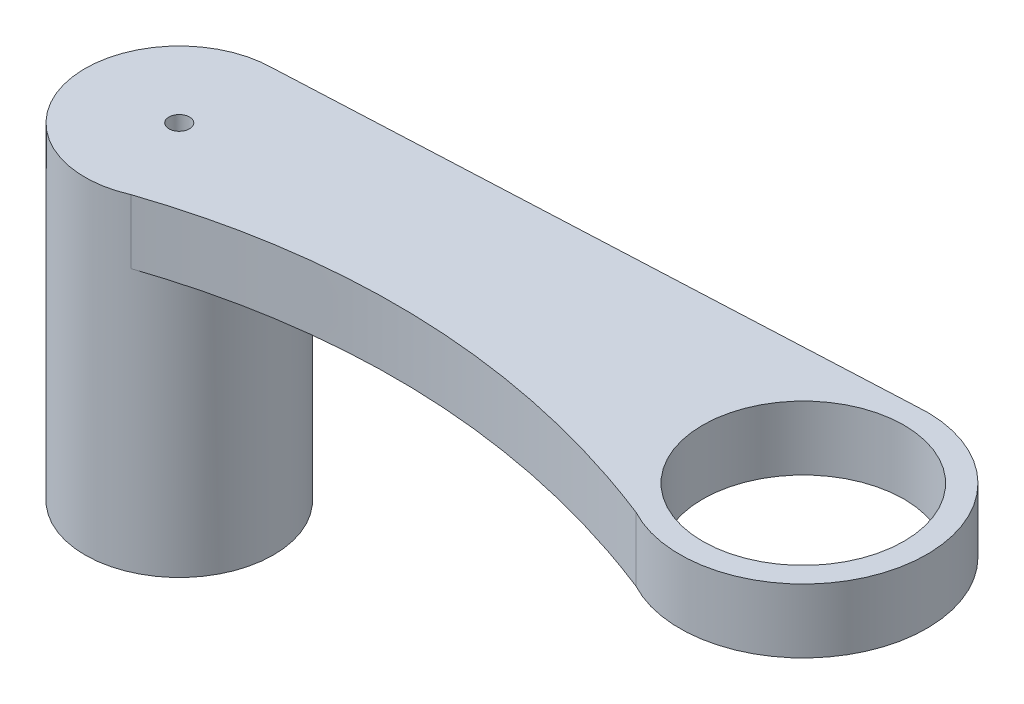
ISO-10303-21;
HEADER;
FILE_DESCRIPTION(('STEP AP214'),'2;1');
FILE_NAME('part.step','',(''),(''),'','','');
FILE_SCHEMA(('AUTOMOTIVE_DESIGN { 1 0 10303 214 1 1 1 1 }'));
ENDSEC;
DATA;
#1=APPLICATION_CONTEXT('core data for automotive mechanical design processes');
#2=APPLICATION_PROTOCOL_DEFINITION('international standard','automotive_design',2000,#1);
#3=PRODUCT_CONTEXT('',#1,'mechanical');
#4=PRODUCT('Part','Part','',(#3));
#5=PRODUCT_RELATED_PRODUCT_CATEGORY('part','',(#4));
#6=PRODUCT_DEFINITION_FORMATION('','',#4);
#7=PRODUCT_DEFINITION_CONTEXT('part definition',#1,'design');
#8=PRODUCT_DEFINITION('design','',#6,#7);
#9=PRODUCT_DEFINITION_SHAPE('','',#8);
#10=(LENGTH_UNIT() NAMED_UNIT(*) SI_UNIT(.MILLI.,.METRE.));
#11=(NAMED_UNIT(*) PLANE_ANGLE_UNIT() SI_UNIT($,.RADIAN.));
#12=(NAMED_UNIT(*) SI_UNIT($,.STERADIAN.) SOLID_ANGLE_UNIT());
#13=UNCERTAINTY_MEASURE_WITH_UNIT(LENGTH_MEASURE(1.E-05),#10,'distance_accuracy_value','');
#14=(GEOMETRIC_REPRESENTATION_CONTEXT(3) GLOBAL_UNCERTAINTY_ASSIGNED_CONTEXT((#13)) GLOBAL_UNIT_ASSIGNED_CONTEXT((#10,
#11,#12)) REPRESENTATION_CONTEXT('',''));
#15=CARTESIAN_POINT('',(0.,0.,0.));
#16=DIRECTION('',(0.,0.,1.));
#17=DIRECTION('',(1.,0.,0.));
#18=AXIS2_PLACEMENT_3D('',#15,#16,#17);
#19=CARTESIAN_POINT('',(0.,35.75,0.));
#20=DIRECTION('',(0.,-1.,0.));
#21=DIRECTION('',(0.,0.,-1.));
#22=AXIS2_PLACEMENT_3D('',#19,#20,#21);
#23=CYLINDRICAL_SURFACE('',#22,10.3);
#24=CARTESIAN_POINT('',(0.,28.75,0.));
#25=DIRECTION('',(0.,-1.,0.));
#26=DIRECTION('',(0.,0.,-1.));
#27=AXIS2_PLACEMENT_3D('',#24,#25,#26);
#28=CIRCLE('',#27,10.3);
#29=CARTESIAN_POINT('',(0.,28.75,-10.3));
#30=VERTEX_POINT('',#29);
#31=CARTESIAN_POINT('',(4.16990453527767,28.75,9.41816840827721));
#32=VERTEX_POINT('',#31);
#33=EDGE_CURVE('E106',#30,#32,#28,.T.);
#34=ORIENTED_EDGE('',*,*,#33,.T.);
#35=DIRECTION('',(0.,1.,0.));
#36=VECTOR('',#35,1.);
#37=CARTESIAN_POINT('',(4.16990453527767,28.75,9.41816840827721));
#38=LINE('',#37,#36);
#39=CARTESIAN_POINT('',(4.16990453527767,35.75,9.41816840827721));
#40=VERTEX_POINT('',#39);
#41=EDGE_CURVE('E69',#32,#40,#38,.T.);
#42=ORIENTED_EDGE('',*,*,#41,.T.);
#43=CARTESIAN_POINT('',(0.,35.75,0.));
#44=DIRECTION('',(0.,1.,0.));
#45=DIRECTION('',(0.,0.,1.));
#46=AXIS2_PLACEMENT_3D('',#43,#44,#45);
#47=CIRCLE('',#46,10.3);
#48=CARTESIAN_POINT('',(0.,35.75,-10.3));
#49=VERTEX_POINT('',#48);
#50=EDGE_CURVE('E11',#49,#40,#47,.T.);
#51=ORIENTED_EDGE('',*,*,#50,.F.);
#52=DIRECTION('',(0.,1.,0.));
#53=VECTOR('',#52,1.);
#54=CARTESIAN_POINT('',(0.,28.75,-10.3));
#55=LINE('',#54,#53);
#56=EDGE_CURVE('E100',#30,#49,#55,.T.);
#57=ORIENTED_EDGE('',*,*,#56,.F.);
#58=EDGE_LOOP('',(#34,#42,#51,#57));
#59=FACE_BOUND('',#58,.T.);
#60=CARTESIAN_POINT('',(0.,0.,0.));
#61=DIRECTION('',(0.,1.,0.));
#62=DIRECTION('',(0.,0.,1.));
#63=AXIS2_PLACEMENT_3D('',#60,#61,#62);
#64=CIRCLE('',#63,10.3);
#65=CARTESIAN_POINT('',(0.,0.,10.3));
#66=VERTEX_POINT('',#65);
#67=EDGE_CURVE('E53',#66,#66,#64,.T.);
#68=ORIENTED_EDGE('',*,*,#67,.T.);
#69=EDGE_LOOP('',(#68));
#70=FACE_BOUND('',#69,.T.);
#71=ADVANCED_FACE('F44',(#59,#70),#23,.T.);
#72=CARTESIAN_POINT('',(0.,35.75,0.));
#73=DIRECTION('',(0.,1.,0.));
#74=DIRECTION('',(0.,0.,1.));
#75=AXIS2_PLACEMENT_3D('',#72,#73,#74);
#76=PLANE('',#75);
#77=CARTESIAN_POINT('',(68.2073015610216,35.75,0.));
#78=DIRECTION('',(0.,1.,0.));
#79=DIRECTION('',(0.,0.,1.));
#80=AXIS2_PLACEMENT_3D('',#77,#78,#79);
#81=CIRCLE('',#80,11.);
#82=CARTESIAN_POINT('',(68.2073015610216,35.75,11.));
#83=VERTEX_POINT('',#82);
#84=EDGE_CURVE('E307',#83,#83,#81,.T.);
#85=ORIENTED_EDGE('',*,*,#84,.F.);
#86=EDGE_LOOP('',(#85));
#87=FACE_BOUND('',#86,.T.);
#88=CARTESIAN_POINT('',(0.,35.75,0.));
#89=DIRECTION('',(0.,-1.,0.));
#90=DIRECTION('',(0.,0.,-1.));
#91=AXIS2_PLACEMENT_3D('',#88,#89,#90);
#92=CIRCLE('',#91,1.12499999999999);
#93=CARTESIAN_POINT('',(0.,35.75,-1.12499999999999));
#94=VERTEX_POINT('',#93);
#95=EDGE_CURVE('E145',#94,#94,#92,.T.);
#96=ORIENTED_EDGE('',*,*,#95,.T.);
#97=EDGE_LOOP('',(#96));
#98=FACE_BOUND('',#97,.T.);
#99=ORIENTED_EDGE('',*,*,#50,.T.);
#100=CARTESIAN_POINT('',(4.16990453527767,35.75,9.41816840827721));
#101=CARTESIAN_POINT('',(22.46177603715,35.75,3.24596138026616));
#102=CARTESIAN_POINT('',(41.93415181531,35.75,4.07724305719363));
#103=CARTESIAN_POINT('',(61.8200064973479,35.75,11.8933789046499));
#104=B_SPLINE_CURVE_WITH_KNOTS('',3,(#100,#101,#102,#103),.UNSPECIFIED.,.F.,.F.,(4,4),(0.,1.),.UNSPECIFIED.);
#105=CARTESIAN_POINT('',(61.8200064973479,35.75,11.8933789046499));
#106=VERTEX_POINT('',#105);
#107=EDGE_CURVE('E84',#40,#106,#104,.T.);
#108=ORIENTED_EDGE('',*,*,#107,.T.);
#109=CARTESIAN_POINT('',(68.2073015610216,35.75,0.));
#110=DIRECTION('',(0.,1.,0.));
#111=DIRECTION('',(0.,0.,1.));
#112=AXIS2_PLACEMENT_3D('',#109,#110,#111);
#113=CIRCLE('',#112,13.5);
#114=CARTESIAN_POINT('',(66.9433570662362,35.75,-13.4407010350689));
#115=VERTEX_POINT('',#114);
#116=EDGE_CURVE('E127',#106,#115,#113,.T.);
#117=ORIENTED_EDGE('',*,*,#116,.T.);
#118=DIRECTION('',(-0.998901267413146,0.,0.0468642503451384));
#119=VECTOR('',#118,1.);
#120=CARTESIAN_POINT('',(66.9433570662362,35.75,-13.4407010350689));
#121=LINE('',#120,#119);
#122=EDGE_CURVE('E60',#115,#49,#121,.T.);
#123=ORIENTED_EDGE('',*,*,#122,.T.);
#124=EDGE_LOOP('',(#99,#108,#117,#123));
#125=FACE_BOUND('',#124,.T.);
#126=ADVANCED_FACE('F156',(#87,#98,#125),#76,.T.);
#127=CARTESIAN_POINT('',(0.,0.,0.));
#128=DIRECTION('',(0.,1.,0.));
#129=DIRECTION('',(0.,0.,1.));
#130=AXIS2_PLACEMENT_3D('',#127,#128,#129);
#131=PLANE('',#130);
#132=CARTESIAN_POINT('',(7.24,0.,0.));
#133=DIRECTION('',(0.,-1.,0.));
#134=DIRECTION('',(0.,0.,-1.));
#135=AXIS2_PLACEMENT_3D('',#132,#133,#134);
#136=CIRCLE('',#135,0.7);
#137=CARTESIAN_POINT('',(7.24,0.,-0.7));
#138=VERTEX_POINT('',#137);
#139=EDGE_CURVE('E308',#138,#138,#136,.T.);
#140=ORIENTED_EDGE('',*,*,#139,.F.);
#141=EDGE_LOOP('',(#140));
#142=FACE_BOUND('',#141,.T.);
#143=CARTESIAN_POINT('',(-7.24,0.,0.));
#144=DIRECTION('',(0.,-1.,0.));
#145=DIRECTION('',(0.,0.,-1.));
#146=AXIS2_PLACEMENT_3D('',#143,#144,#145);
#147=CIRCLE('',#146,0.7);
#148=CARTESIAN_POINT('',(-7.24,0.,-0.7));
#149=VERTEX_POINT('',#148);
#150=EDGE_CURVE('E314',#149,#149,#147,.T.);
#151=ORIENTED_EDGE('',*,*,#150,.F.);
#152=EDGE_LOOP('',(#151));
#153=FACE_BOUND('',#152,.T.);
#154=CARTESIAN_POINT('',(0.,0.,-7.24));
#155=DIRECTION('',(0.,-1.,0.));
#156=DIRECTION('',(0.,0.,-1.));
#157=AXIS2_PLACEMENT_3D('',#154,#155,#156);
#158=CIRCLE('',#157,0.7);
#159=CARTESIAN_POINT('',(0.,0.,-7.94));
#160=VERTEX_POINT('',#159);
#161=EDGE_CURVE('E324',#160,#160,#158,.T.);
#162=ORIENTED_EDGE('',*,*,#161,.F.);
#163=EDGE_LOOP('',(#162));
#164=FACE_BOUND('',#163,.T.);
#165=CARTESIAN_POINT('',(0.,0.,7.24));
#166=DIRECTION('',(0.,-1.,0.));
#167=DIRECTION('',(0.,0.,-1.));
#168=AXIS2_PLACEMENT_3D('',#165,#166,#167);
#169=CIRCLE('',#168,0.7);
#170=CARTESIAN_POINT('',(0.,0.,6.54));
#171=VERTEX_POINT('',#170);
#172=EDGE_CURVE('E332',#171,#171,#169,.T.);
#173=ORIENTED_EDGE('',*,*,#172,.F.);
#174=EDGE_LOOP('',(#173));
#175=FACE_BOUND('',#174,.T.);
#176=CARTESIAN_POINT('',(0.,0.,0.));
#177=DIRECTION('',(0.,-1.,0.));
#178=DIRECTION('',(0.,0.,-1.));
#179=AXIS2_PLACEMENT_3D('',#176,#177,#178);
#180=CIRCLE('',#179,1.125);
#181=CARTESIAN_POINT('',(0.,0.,-1.125));
#182=VERTEX_POINT('',#181);
#183=EDGE_CURVE('E137',#182,#182,#180,.T.);
#184=ORIENTED_EDGE('',*,*,#183,.F.);
#185=EDGE_LOOP('',(#184));
#186=FACE_BOUND('',#185,.T.);
#187=ORIENTED_EDGE('',*,*,#67,.F.);
#188=EDGE_LOOP('',(#187));
#189=FACE_BOUND('',#188,.T.);
#190=ADVANCED_FACE('F153',(#142,#153,#164,#175,#186,#189),#131,.F.);
#191=CARTESIAN_POINT('',(0.,0.,0.));
#192=DIRECTION('',(0.,-1.,0.));
#193=DIRECTION('',(0.,0.,-1.));
#194=AXIS2_PLACEMENT_3D('',#191,#192,#193);
#195=CYLINDRICAL_SURFACE('',#194,1.12499999999999);
#196=ORIENTED_EDGE('',*,*,#95,.F.);
#197=EDGE_LOOP('',(#196));
#198=FACE_BOUND('',#197,.T.);
#199=ORIENTED_EDGE('',*,*,#183,.T.);
#200=EDGE_LOOP('',(#199));
#201=FACE_BOUND('',#200,.T.);
#202=ADVANCED_FACE('F155',(#198,#201),#195,.F.);
#203=CARTESIAN_POINT('',(4.16990453527767,28.75,9.41816840827721));
#204=CARTESIAN_POINT('',(22.46177603715,28.75,3.24596138026616));
#205=CARTESIAN_POINT('',(41.93415181531,28.75,4.07724305719363));
#206=CARTESIAN_POINT('',(61.8200064973479,28.75,11.8933789046499));
#207=B_SPLINE_CURVE_WITH_KNOTS('',3,(#203,#204,#205,#206),.UNSPECIFIED.,.F.,.F.,(4,4),(0.,1.),.UNSPECIFIED.);
#208=DIRECTION('',(0.,1.,0.));
#209=VECTOR('',#208,1.);
#210=SURFACE_OF_LINEAR_EXTRUSION('',#207,#209);
#211=ORIENTED_EDGE('',*,*,#107,.F.);
#212=ORIENTED_EDGE('',*,*,#41,.F.);
#213=CARTESIAN_POINT('',(61.8200064973479,28.75,11.8933789046499));
#214=VERTEX_POINT('',#213);
#215=EDGE_CURVE('E112',#32,#214,#207,.T.);
#216=ORIENTED_EDGE('',*,*,#215,.T.);
#217=DIRECTION('',(0.,1.,0.));
#218=VECTOR('',#217,1.);
#219=CARTESIAN_POINT('',(61.8200064973479,28.75,11.8933789046499));
#220=LINE('',#219,#218);
#221=EDGE_CURVE('E90',#214,#106,#220,.T.);
#222=ORIENTED_EDGE('',*,*,#221,.T.);
#223=EDGE_LOOP('',(#211,#212,#216,#222));
#224=FACE_BOUND('',#223,.T.);
#225=ADVANCED_FACE('F163',(#224),#210,.T.);
#226=CARTESIAN_POINT('',(66.9433570662362,28.75,-13.4407010350689));
#227=DIRECTION('',(-0.0468642503451384,0.,-0.998901267413145));
#228=DIRECTION('',(-0.998901267413146,0.,0.0468642503451384));
#229=AXIS2_PLACEMENT_3D('',#226,#227,#228);
#230=PLANE('',#229);
#231=ORIENTED_EDGE('',*,*,#122,.F.);
#232=DIRECTION('',(0.,1.,0.));
#233=VECTOR('',#232,1.);
#234=CARTESIAN_POINT('',(66.9433570662362,28.75,-13.4407010350689));
#235=LINE('',#234,#233);
#236=CARTESIAN_POINT('',(66.9433570662362,28.75,-13.4407010350689));
#237=VERTEX_POINT('',#236);
#238=EDGE_CURVE('E94',#237,#115,#235,.T.);
#239=ORIENTED_EDGE('',*,*,#238,.F.);
#240=DIRECTION('',(-0.998901267413146,0.,0.0468642503451384));
#241=VECTOR('',#240,1.);
#242=CARTESIAN_POINT('',(66.9433570662362,28.75,-13.4407010350689));
#243=LINE('',#242,#241);
#244=EDGE_CURVE('E97',#237,#30,#243,.T.);
#245=ORIENTED_EDGE('',*,*,#244,.T.);
#246=ORIENTED_EDGE('',*,*,#56,.T.);
#247=EDGE_LOOP('',(#231,#239,#245,#246));
#248=FACE_BOUND('',#247,.T.);
#249=ADVANCED_FACE('F96',(#248),#230,.T.);
#250=CARTESIAN_POINT('',(68.2073015610216,28.75,0.));
#251=DIRECTION('',(0.,1.,0.));
#252=DIRECTION('',(0.,0.,1.));
#253=AXIS2_PLACEMENT_3D('',#250,#251,#252);
#254=CYLINDRICAL_SURFACE('',#253,13.5);
#255=ORIENTED_EDGE('',*,*,#116,.F.);
#256=ORIENTED_EDGE('',*,*,#221,.F.);
#257=CARTESIAN_POINT('',(68.2073015610216,28.75,0.));
#258=DIRECTION('',(0.,1.,0.));
#259=DIRECTION('',(0.,0.,1.));
#260=AXIS2_PLACEMENT_3D('',#257,#258,#259);
#261=CIRCLE('',#260,13.5);
#262=EDGE_CURVE('E104',#214,#237,#261,.T.);
#263=ORIENTED_EDGE('',*,*,#262,.T.);
#264=ORIENTED_EDGE('',*,*,#238,.T.);
#265=EDGE_LOOP('',(#255,#256,#263,#264));
#266=FACE_BOUND('',#265,.T.);
#267=ADVANCED_FACE('F110',(#266),#254,.T.);
#268=CARTESIAN_POINT('',(32.3972118237507,28.75,5.41014507816331));
#269=DIRECTION('',(0.,1.,0.));
#270=DIRECTION('',(0.,0.,1.));
#271=AXIS2_PLACEMENT_3D('',#268,#269,#270);
#272=PLANE('',#271);
#273=CARTESIAN_POINT('',(68.2073015610216,28.75,0.));
#274=DIRECTION('',(0.,1.,0.));
#275=DIRECTION('',(0.,0.,1.));
#276=AXIS2_PLACEMENT_3D('',#273,#274,#275);
#277=CIRCLE('',#276,11.);
#278=CARTESIAN_POINT('',(68.2073015610216,28.75,11.));
#279=VERTEX_POINT('',#278);
#280=EDGE_CURVE('E47',#279,#279,#277,.T.);
#281=ORIENTED_EDGE('',*,*,#280,.T.);
#282=EDGE_LOOP('',(#281));
#283=FACE_BOUND('',#282,.T.);
#284=ORIENTED_EDGE('',*,*,#215,.F.);
#285=ORIENTED_EDGE('',*,*,#33,.F.);
#286=ORIENTED_EDGE('',*,*,#244,.F.);
#287=ORIENTED_EDGE('',*,*,#262,.F.);
#288=EDGE_LOOP('',(#284,#285,#286,#287));
#289=FACE_BOUND('',#288,.T.);
#290=ADVANCED_FACE('F103',(#283,#289),#272,.F.);
#291=CARTESIAN_POINT('',(68.2073015610216,35.75,0.));
#292=DIRECTION('',(0.,1.,0.));
#293=DIRECTION('',(0.,0.,1.));
#294=AXIS2_PLACEMENT_3D('',#291,#292,#293);
#295=CYLINDRICAL_SURFACE('',#294,11.);
#296=ORIENTED_EDGE('',*,*,#84,.T.);
#297=EDGE_LOOP('',(#296));
#298=FACE_BOUND('',#297,.T.);
#299=ORIENTED_EDGE('',*,*,#280,.F.);
#300=EDGE_LOOP('',(#299));
#301=FACE_BOUND('',#300,.T.);
#302=ADVANCED_FACE('F210',(#298,#301),#295,.F.);
#303=CARTESIAN_POINT('',(0.,7.,7.24));
#304=DIRECTION('',(0.,-1.,0.));
#305=DIRECTION('',(0.,0.,-1.));
#306=AXIS2_PLACEMENT_3D('',#303,#304,#305);
#307=CYLINDRICAL_SURFACE('',#306,0.7);
#308=CARTESIAN_POINT('',(0.,7.,7.24));
#309=DIRECTION('',(0.,-1.,0.));
#310=DIRECTION('',(0.,0.,-1.));
#311=AXIS2_PLACEMENT_3D('',#308,#309,#310);
#312=CIRCLE('',#311,0.7);
#313=CARTESIAN_POINT('',(0.,7.,6.54));
#314=VERTEX_POINT('',#313);
#315=EDGE_CURVE('E336',#314,#314,#312,.T.);
#316=ORIENTED_EDGE('',*,*,#315,.F.);
#317=EDGE_LOOP('',(#316));
#318=FACE_BOUND('',#317,.T.);
#319=ORIENTED_EDGE('',*,*,#172,.T.);
#320=EDGE_LOOP('',(#319));
#321=FACE_BOUND('',#320,.T.);
#322=ADVANCED_FACE('F218',(#318,#321),#307,.F.);
#323=CARTESIAN_POINT('',(0.,7.,7.24));
#324=DIRECTION('',(0.,-1.,0.));
#325=DIRECTION('',(0.,0.,-1.));
#326=AXIS2_PLACEMENT_3D('',#323,#324,#325);
#327=PLANE('',#326);
#328=ORIENTED_EDGE('',*,*,#315,.T.);
#329=EDGE_LOOP('',(#328));
#330=FACE_BOUND('',#329,.T.);
#331=ADVANCED_FACE('F230',(#330),#327,.T.);
#332=CARTESIAN_POINT('',(0.,7.,-7.24));
#333=DIRECTION('',(0.,-1.,0.));
#334=DIRECTION('',(0.,0.,-1.));
#335=AXIS2_PLACEMENT_3D('',#332,#333,#334);
#336=CYLINDRICAL_SURFACE('',#335,0.7);
#337=CARTESIAN_POINT('',(0.,7.,-7.24));
#338=DIRECTION('',(0.,-1.,0.));
#339=DIRECTION('',(0.,0.,-1.));
#340=AXIS2_PLACEMENT_3D('',#337,#338,#339);
#341=CIRCLE('',#340,0.7);
#342=CARTESIAN_POINT('',(0.,7.,-7.94));
#343=VERTEX_POINT('',#342);
#344=EDGE_CURVE('E328',#343,#343,#341,.T.);
#345=ORIENTED_EDGE('',*,*,#344,.F.);
#346=EDGE_LOOP('',(#345));
#347=FACE_BOUND('',#346,.T.);
#348=ORIENTED_EDGE('',*,*,#161,.T.);
#349=EDGE_LOOP('',(#348));
#350=FACE_BOUND('',#349,.T.);
#351=ADVANCED_FACE('F240',(#347,#350),#336,.F.);
#352=CARTESIAN_POINT('',(0.,7.,-7.24));
#353=DIRECTION('',(0.,-1.,0.));
#354=DIRECTION('',(0.,0.,-1.));
#355=AXIS2_PLACEMENT_3D('',#352,#353,#354);
#356=PLANE('',#355);
#357=ORIENTED_EDGE('',*,*,#344,.T.);
#358=EDGE_LOOP('',(#357));
#359=FACE_BOUND('',#358,.T.);
#360=ADVANCED_FACE('F250',(#359),#356,.T.);
#361=CARTESIAN_POINT('',(-7.24,7.,0.));
#362=DIRECTION('',(0.,-1.,0.));
#363=DIRECTION('',(0.,0.,-1.));
#364=AXIS2_PLACEMENT_3D('',#361,#362,#363);
#365=CYLINDRICAL_SURFACE('',#364,0.7);
#366=CARTESIAN_POINT('',(-7.24,7.,0.));
#367=DIRECTION('',(0.,-1.,0.));
#368=DIRECTION('',(0.,0.,-1.));
#369=AXIS2_PLACEMENT_3D('',#366,#367,#368);
#370=CIRCLE('',#369,0.7);
#371=CARTESIAN_POINT('',(-7.24,7.,-0.7));
#372=VERTEX_POINT('',#371);
#373=EDGE_CURVE('E320',#372,#372,#370,.T.);
#374=ORIENTED_EDGE('',*,*,#373,.F.);
#375=EDGE_LOOP('',(#374));
#376=FACE_BOUND('',#375,.T.);
#377=ORIENTED_EDGE('',*,*,#150,.T.);
#378=EDGE_LOOP('',(#377));
#379=FACE_BOUND('',#378,.T.);
#380=ADVANCED_FACE('F260',(#376,#379),#365,.F.);
#381=CARTESIAN_POINT('',(-7.24,7.,0.));
#382=DIRECTION('',(0.,-1.,0.));
#383=DIRECTION('',(0.,0.,-1.));
#384=AXIS2_PLACEMENT_3D('',#381,#382,#383);
#385=PLANE('',#384);
#386=ORIENTED_EDGE('',*,*,#373,.T.);
#387=EDGE_LOOP('',(#386));
#388=FACE_BOUND('',#387,.T.);
#389=ADVANCED_FACE('F270',(#388),#385,.T.);
#390=CARTESIAN_POINT('',(7.24,7.,0.));
#391=DIRECTION('',(0.,-1.,0.));
#392=DIRECTION('',(0.,0.,-1.));
#393=AXIS2_PLACEMENT_3D('',#390,#391,#392);
#394=CYLINDRICAL_SURFACE('',#393,0.7);
#395=CARTESIAN_POINT('',(7.24,7.,0.));
#396=DIRECTION('',(0.,-1.,0.));
#397=DIRECTION('',(0.,0.,-1.));
#398=AXIS2_PLACEMENT_3D('',#395,#396,#397);
#399=CIRCLE('',#398,0.7);
#400=CARTESIAN_POINT('',(7.24,7.,-0.7));
#401=VERTEX_POINT('',#400);
#402=EDGE_CURVE('E305',#401,#401,#399,.T.);
#403=ORIENTED_EDGE('',*,*,#402,.F.);
#404=EDGE_LOOP('',(#403));
#405=FACE_BOUND('',#404,.T.);
#406=ORIENTED_EDGE('',*,*,#139,.T.);
#407=EDGE_LOOP('',(#406));
#408=FACE_BOUND('',#407,.T.);
#409=ADVANCED_FACE('F280',(#405,#408),#394,.F.);
#410=CARTESIAN_POINT('',(7.24,7.,0.));
#411=DIRECTION('',(0.,-1.,0.));
#412=DIRECTION('',(0.,0.,-1.));
#413=AXIS2_PLACEMENT_3D('',#410,#411,#412);
#414=PLANE('',#413);
#415=ORIENTED_EDGE('',*,*,#402,.T.);
#416=EDGE_LOOP('',(#415));
#417=FACE_BOUND('',#416,.T.);
#418=ADVANCED_FACE('F290',(#417),#414,.T.);
#419=CLOSED_SHELL('',(#71,#126,#190,#202,#225,#249,#267,#290,#302,#322,#331,#351,#360,#380,#389,
#409,#418));
#420=MANIFOLD_SOLID_BREP('B2',#419);
#421=ADVANCED_BREP_SHAPE_REPRESENTATION('',(#18,#420),#14);
#422=SHAPE_DEFINITION_REPRESENTATION(#9,#421);
ENDSEC;
END-ISO-10303-21;
